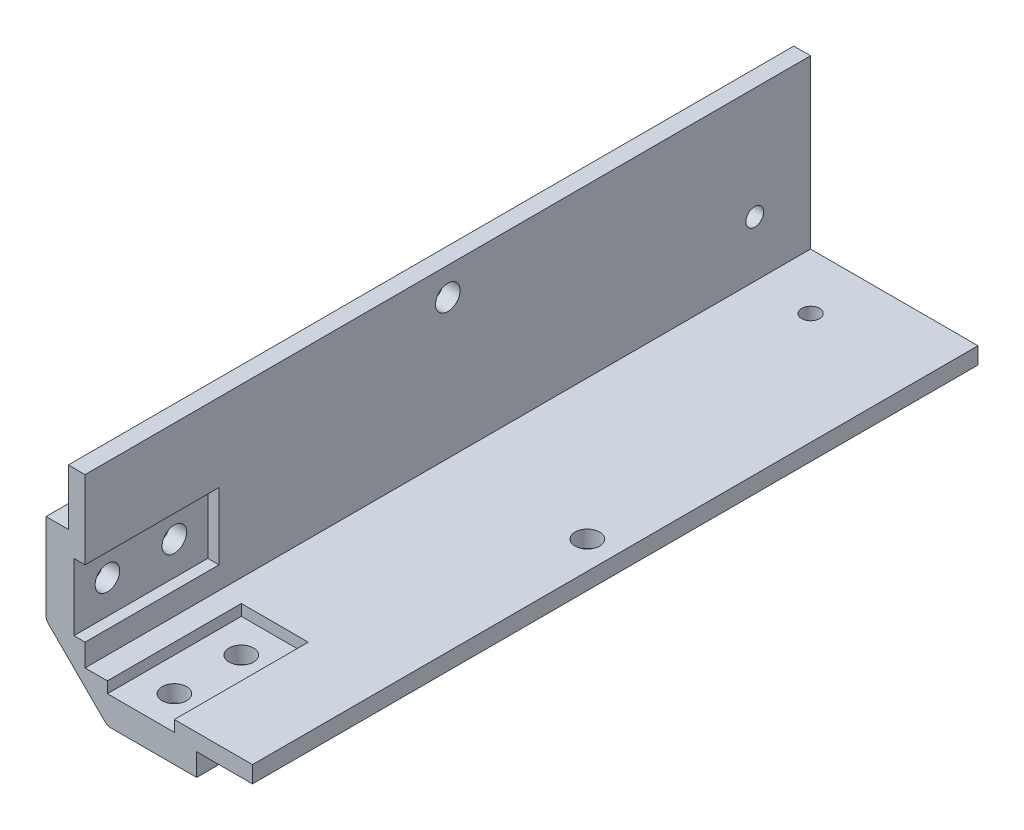
ISO-10303-21;
HEADER;
FILE_DESCRIPTION(('STEP AP214'),'2;1');
FILE_NAME('part.step','',(''),(''),'','','');
FILE_SCHEMA(('AUTOMOTIVE_DESIGN { 1 0 10303 214 1 1 1 1 }'));
ENDSEC;
DATA;
#1=APPLICATION_CONTEXT('core data for automotive mechanical design processes');
#2=APPLICATION_PROTOCOL_DEFINITION('international standard','automotive_design',2000,#1);
#3=PRODUCT_CONTEXT('',#1,'mechanical');
#4=PRODUCT('Part','Part','',(#3));
#5=PRODUCT_RELATED_PRODUCT_CATEGORY('part','',(#4));
#6=PRODUCT_DEFINITION_FORMATION('','',#4);
#7=PRODUCT_DEFINITION_CONTEXT('part definition',#1,'design');
#8=PRODUCT_DEFINITION('design','',#6,#7);
#9=PRODUCT_DEFINITION_SHAPE('','',#8);
#10=(LENGTH_UNIT() NAMED_UNIT(*) SI_UNIT(.MILLI.,.METRE.));
#11=(NAMED_UNIT(*) PLANE_ANGLE_UNIT() SI_UNIT($,.RADIAN.));
#12=(NAMED_UNIT(*) SI_UNIT($,.STERADIAN.) SOLID_ANGLE_UNIT());
#13=UNCERTAINTY_MEASURE_WITH_UNIT(LENGTH_MEASURE(1.E-05),#10,'distance_accuracy_value','');
#14=(GEOMETRIC_REPRESENTATION_CONTEXT(3) GLOBAL_UNCERTAINTY_ASSIGNED_CONTEXT((#13)) GLOBAL_UNIT_ASSIGNED_CONTEXT((#10,
#11,#12)) REPRESENTATION_CONTEXT('',''));
#15=CARTESIAN_POINT('',(0.,0.,0.));
#16=DIRECTION('',(0.,0.,1.));
#17=DIRECTION('',(1.,0.,0.));
#18=AXIS2_PLACEMENT_3D('',#15,#16,#17);
#19=CARTESIAN_POINT('',(0.,0.,150.));
#20=DIRECTION('',(1.,0.,0.));
#21=DIRECTION('',(0.,1.,0.));
#22=AXIS2_PLACEMENT_3D('',#19,#20,#21);
#23=PLANE('',#22);
#24=CARTESIAN_POINT('',(0.,25.,215.));
#25=DIRECTION('',(-1.,0.,0.));
#26=DIRECTION('',(0.,0.,1.));
#27=AXIS2_PLACEMENT_3D('',#24,#25,#26);
#28=CIRCLE('',#27,2.19999999999999);
#29=CARTESIAN_POINT('',(0.,25.,217.2));
#30=VERTEX_POINT('',#29);
#31=EDGE_CURVE('E879',#30,#30,#28,.T.);
#32=ORIENTED_EDGE('',*,*,#31,.T.);
#33=EDGE_LOOP('',(#32));
#34=FACE_BOUND('',#33,.T.);
#35=CARTESIAN_POINT('',(0.,9.99999999999999,160.));
#36=DIRECTION('',(1.,0.,0.));
#37=DIRECTION('',(0.,1.,0.));
#38=AXIS2_PLACEMENT_3D('',#35,#36,#37);
#39=CIRCLE('',#38,1.59999999999999);
#40=CARTESIAN_POINT('',(0.,11.6,160.));
#41=VERTEX_POINT('',#40);
#42=EDGE_CURVE('E299',#41,#41,#39,.T.);
#43=ORIENTED_EDGE('',*,*,#42,.F.);
#44=EDGE_LOOP('',(#43));
#45=FACE_BOUND('',#44,.T.);
#46=DIRECTION('',(0.,1.,0.));
#47=VECTOR('',#46,1.);
#48=CARTESIAN_POINT('',(0.,0.,280.));
#49=LINE('',#48,#47);
#50=CARTESIAN_POINT('',(0.,16.,280.));
#51=VERTEX_POINT('',#50);
#52=CARTESIAN_POINT('',(0.,30.,280.));
#53=VERTEX_POINT('',#52);
#54=EDGE_CURVE('E405',#51,#53,#49,.T.);
#55=ORIENTED_EDGE('',*,*,#54,.F.);
#56=DIRECTION('',(0.,0.,-1.));
#57=VECTOR('',#56,1.);
#58=CARTESIAN_POINT('',(0.,16.,280.));
#59=LINE('',#58,#57);
#60=CARTESIAN_POINT('',(0.,16.,256.));
#61=VERTEX_POINT('',#60);
#62=EDGE_CURVE('E213',#51,#61,#59,.T.);
#63=ORIENTED_EDGE('',*,*,#62,.T.);
#64=DIRECTION('',(0.,-1.,0.));
#65=VECTOR('',#64,1.);
#66=CARTESIAN_POINT('',(0.,16.,256.));
#67=LINE('',#66,#65);
#68=CARTESIAN_POINT('',(0.,3.99999999999999,256.));
#69=VERTEX_POINT('',#68);
#70=EDGE_CURVE('E461',#61,#69,#67,.T.);
#71=ORIENTED_EDGE('',*,*,#70,.T.);
#72=DIRECTION('',(0.,0.,-1.));
#73=VECTOR('',#72,1.);
#74=CARTESIAN_POINT('',(0.,3.99999999999999,280.));
#75=LINE('',#74,#73);
#76=CARTESIAN_POINT('',(0.,3.99999999999999,280.));
#77=VERTEX_POINT('',#76);
#78=EDGE_CURVE('E455',#77,#69,#75,.T.);
#79=ORIENTED_EDGE('',*,*,#78,.F.);
#80=CARTESIAN_POINT('',(0.,0.,280.));
#81=VERTEX_POINT('',#80);
#82=EDGE_CURVE('E218',#81,#77,#49,.T.);
#83=ORIENTED_EDGE('',*,*,#82,.F.);
#84=DIRECTION('',(0.,0.,1.));
#85=VECTOR('',#84,1.);
#86=CARTESIAN_POINT('',(0.,0.,150.));
#87=LINE('',#86,#85);
#88=CARTESIAN_POINT('',(0.,0.,150.));
#89=VERTEX_POINT('',#88);
#90=EDGE_CURVE('E387',#89,#81,#87,.T.);
#91=ORIENTED_EDGE('',*,*,#90,.F.);
#92=DIRECTION('',(0.,1.,0.));
#93=VECTOR('',#92,1.);
#94=CARTESIAN_POINT('',(0.,0.,150.));
#95=LINE('',#94,#93);
#96=CARTESIAN_POINT('',(0.,30.,150.));
#97=VERTEX_POINT('',#96);
#98=EDGE_CURVE('E380',#89,#97,#95,.T.);
#99=ORIENTED_EDGE('',*,*,#98,.T.);
#100=DIRECTION('',(0.,0.,-1.));
#101=VECTOR('',#100,1.);
#102=CARTESIAN_POINT('',(0.,30.,280.));
#103=LINE('',#102,#101);
#104=EDGE_CURVE('E322',#53,#97,#103,.T.);
#105=ORIENTED_EDGE('',*,*,#104,.F.);
#106=EDGE_LOOP('',(#55,#63,#71,#79,#83,#91,#99,#105));
#107=FACE_BOUND('',#106,.T.);
#108=ADVANCED_FACE('F49',(#34,#45,#107),#23,.T.);
#109=CARTESIAN_POINT('',(0.,0.,280.));
#110=DIRECTION('',(0.,0.,1.));
#111=DIRECTION('',(1.,0.,0.));
#112=AXIS2_PLACEMENT_3D('',#109,#110,#111);
#113=PLANE('',#112);
#114=DIRECTION('',(0.,-1.,0.));
#115=VECTOR('',#114,1.);
#116=CARTESIAN_POINT('',(-2.,16.,280.));
#117=LINE('',#116,#115);
#118=CARTESIAN_POINT('',(-2.,16.,280.));
#119=VERTEX_POINT('',#118);
#120=CARTESIAN_POINT('',(-2.,3.99999999999999,280.));
#121=VERTEX_POINT('',#120);
#122=EDGE_CURVE('E206',#119,#121,#117,.T.);
#123=ORIENTED_EDGE('',*,*,#122,.F.);
#124=DIRECTION('',(1.,0.,0.));
#125=VECTOR('',#124,1.);
#126=CARTESIAN_POINT('',(-2.,16.,280.));
#127=LINE('',#126,#125);
#128=EDGE_CURVE('E235',#119,#51,#127,.T.);
#129=ORIENTED_EDGE('',*,*,#128,.T.);
#130=ORIENTED_EDGE('',*,*,#54,.T.);
#131=DIRECTION('',(1.,0.,0.));
#132=VECTOR('',#131,1.);
#133=CARTESIAN_POINT('',(-3.,30.,280.));
#134=LINE('',#133,#132);
#135=CARTESIAN_POINT('',(-3.,30.,280.));
#136=VERTEX_POINT('',#135);
#137=EDGE_CURVE('E318',#136,#53,#134,.T.);
#138=ORIENTED_EDGE('',*,*,#137,.F.);
#139=DIRECTION('',(0.,-1.,0.));
#140=VECTOR('',#139,1.);
#141=CARTESIAN_POINT('',(-3.,20.,280.));
#142=LINE('',#141,#140);
#143=CARTESIAN_POINT('',(-3.,20.,280.));
#144=VERTEX_POINT('',#143);
#145=EDGE_CURVE('E366',#136,#144,#142,.T.);
#146=ORIENTED_EDGE('',*,*,#145,.T.);
#147=DIRECTION('',(1.,0.,0.));
#148=VECTOR('',#147,1.);
#149=CARTESIAN_POINT('',(-137.648383074572,20.,280.));
#150=LINE('',#149,#148);
#151=CARTESIAN_POINT('',(-7.00000000000001,20.,280.));
#152=VERTEX_POINT('',#151);
#153=EDGE_CURVE('E305',#152,#144,#150,.T.);
#154=ORIENTED_EDGE('',*,*,#153,.F.);
#155=DIRECTION('',(0.,-1.,0.));
#156=VECTOR('',#155,1.);
#157=CARTESIAN_POINT('',(-7.,7.,280.));
#158=LINE('',#157,#156);
#159=CARTESIAN_POINT('',(-7.,4.62132034355964,280.));
#160=VERTEX_POINT('',#159);
#161=EDGE_CURVE('E360',#152,#160,#158,.T.);
#162=ORIENTED_EDGE('',*,*,#161,.T.);
#163=CARTESIAN_POINT('',(-5.5,4.62132034355964,280.));
#164=DIRECTION('',(0.,0.,1.));
#165=DIRECTION('',(1.,0.,0.));
#166=AXIS2_PLACEMENT_3D('',#163,#164,#165);
#167=CIRCLE('',#166,1.5);
#168=CARTESIAN_POINT('',(-6.56066017177982,3.56066017177982,280.));
#169=VERTEX_POINT('',#168);
#170=EDGE_CURVE('E420',#160,#169,#167,.T.);
#171=ORIENTED_EDGE('',*,*,#170,.T.);
#172=DIRECTION('',(0.707106781186548,-0.707106781186548,0.));
#173=VECTOR('',#172,1.);
#174=CARTESIAN_POINT('',(-7.,4.,280.));
#175=LINE('',#174,#173);
#176=CARTESIAN_POINT('',(3.56066017177982,-6.56066017177982,280.));
#177=VERTEX_POINT('',#176);
#178=EDGE_CURVE('E391',#169,#177,#175,.T.);
#179=ORIENTED_EDGE('',*,*,#178,.T.);
#180=CARTESIAN_POINT('',(4.62132034355964,-5.5,280.));
#181=DIRECTION('',(0.,0.,1.));
#182=DIRECTION('',(1.,0.,0.));
#183=AXIS2_PLACEMENT_3D('',#180,#181,#182);
#184=CIRCLE('',#183,1.5);
#185=CARTESIAN_POINT('',(4.62132034355964,-7.,280.));
#186=VERTEX_POINT('',#185);
#187=EDGE_CURVE('E417',#177,#186,#184,.T.);
#188=ORIENTED_EDGE('',*,*,#187,.T.);
#189=DIRECTION('',(1.,0.,0.));
#190=VECTOR('',#189,1.);
#191=CARTESIAN_POINT('',(4.,-7.,280.));
#192=LINE('',#191,#190);
#193=CARTESIAN_POINT('',(20.,-7.00000000000001,280.));
#194=VERTEX_POINT('',#193);
#195=EDGE_CURVE('E395',#186,#194,#192,.T.);
#196=ORIENTED_EDGE('',*,*,#195,.T.);
#197=DIRECTION('',(0.,1.,0.));
#198=VECTOR('',#197,1.);
#199=CARTESIAN_POINT('',(20.,-137.648383074572,280.));
#200=LINE('',#199,#198);
#201=CARTESIAN_POINT('',(20.,-3.,280.));
#202=VERTEX_POINT('',#201);
#203=EDGE_CURVE('E334',#194,#202,#200,.T.);
#204=ORIENTED_EDGE('',*,*,#203,.T.);
#205=DIRECTION('',(1.,0.,0.));
#206=VECTOR('',#205,1.);
#207=CARTESIAN_POINT('',(7.,-3.,280.));
#208=LINE('',#207,#206);
#209=CARTESIAN_POINT('',(30.,-3.,280.));
#210=VERTEX_POINT('',#209);
#211=EDGE_CURVE('E398',#202,#210,#208,.T.);
#212=ORIENTED_EDGE('',*,*,#211,.T.);
#213=DIRECTION('',(0.,-1.,0.));
#214=VECTOR('',#213,1.);
#215=CARTESIAN_POINT('',(30.,0.,280.));
#216=LINE('',#215,#214);
#217=CARTESIAN_POINT('',(30.,0.,280.));
#218=VERTEX_POINT('',#217);
#219=EDGE_CURVE('E348',#218,#210,#216,.T.);
#220=ORIENTED_EDGE('',*,*,#219,.F.);
#221=DIRECTION('',(-1.,0.,0.));
#222=VECTOR('',#221,1.);
#223=CARTESIAN_POINT('',(20.,0.,280.));
#224=LINE('',#223,#222);
#225=CARTESIAN_POINT('',(16.,0.,280.));
#226=VERTEX_POINT('',#225);
#227=EDGE_CURVE('E401',#218,#226,#224,.T.);
#228=ORIENTED_EDGE('',*,*,#227,.T.);
#229=DIRECTION('',(0.,1.,0.));
#230=VECTOR('',#229,1.);
#231=CARTESIAN_POINT('',(16.,-2.,280.));
#232=LINE('',#231,#230);
#233=CARTESIAN_POINT('',(16.,-2.,280.));
#234=VERTEX_POINT('',#233);
#235=EDGE_CURVE('E278',#234,#226,#232,.T.);
#236=ORIENTED_EDGE('',*,*,#235,.F.);
#237=DIRECTION('',(1.,0.,0.));
#238=VECTOR('',#237,1.);
#239=CARTESIAN_POINT('',(4.,-2.,280.));
#240=LINE('',#239,#238);
#241=CARTESIAN_POINT('',(4.,-2.,280.));
#242=VERTEX_POINT('',#241);
#243=EDGE_CURVE('E250',#242,#234,#240,.T.);
#244=ORIENTED_EDGE('',*,*,#243,.F.);
#245=DIRECTION('',(0.,1.,0.));
#246=VECTOR('',#245,1.);
#247=CARTESIAN_POINT('',(4.,-2.,280.));
#248=LINE('',#247,#246);
#249=CARTESIAN_POINT('',(4.,0.,280.));
#250=VERTEX_POINT('',#249);
#251=EDGE_CURVE('E261',#242,#250,#248,.T.);
#252=ORIENTED_EDGE('',*,*,#251,.T.);
#253=EDGE_CURVE('E400',#250,#81,#224,.T.);
#254=ORIENTED_EDGE('',*,*,#253,.T.);
#255=ORIENTED_EDGE('',*,*,#82,.T.);
#256=DIRECTION('',(1.,0.,0.));
#257=VECTOR('',#256,1.);
#258=CARTESIAN_POINT('',(-2.,3.99999999999999,280.));
#259=LINE('',#258,#257);
#260=EDGE_CURVE('E201',#121,#77,#259,.T.);
#261=ORIENTED_EDGE('',*,*,#260,.F.);
#262=EDGE_LOOP('',(#123,#129,#130,#138,#146,#154,#162,#171,#179,#188,#196,#204,#212,#220,#228,
#236,#244,#252,#254,#255,#261));
#263=FACE_BOUND('',#262,.T.);
#264=ADVANCED_FACE('F216',(#263),#113,.T.);
#265=CARTESIAN_POINT('',(-3.,20.,150.));
#266=DIRECTION('',(-1.,0.,0.));
#267=DIRECTION('',(0.,0.,1.));
#268=AXIS2_PLACEMENT_3D('',#265,#266,#267);
#269=PLANE('',#268);
#270=CARTESIAN_POINT('',(-3.,25.,215.));
#271=DIRECTION('',(-1.,0.,0.));
#272=DIRECTION('',(0.,0.,1.));
#273=AXIS2_PLACEMENT_3D('',#270,#271,#272);
#274=CIRCLE('',#273,2.19999999999999);
#275=CARTESIAN_POINT('',(-3.,25.,217.2));
#276=VERTEX_POINT('',#275);
#277=EDGE_CURVE('E873',#276,#276,#274,.T.);
#278=ORIENTED_EDGE('',*,*,#277,.F.);
#279=EDGE_LOOP('',(#278));
#280=FACE_BOUND('',#279,.T.);
#281=DIRECTION('',(0.,-1.,0.));
#282=VECTOR('',#281,1.);
#283=CARTESIAN_POINT('',(-3.,20.,150.));
#284=LINE('',#283,#282);
#285=CARTESIAN_POINT('',(-3.,30.,150.));
#286=VERTEX_POINT('',#285);
#287=CARTESIAN_POINT('',(-3.,20.,150.));
#288=VERTEX_POINT('',#287);
#289=EDGE_CURVE('E383',#286,#288,#284,.T.);
#290=ORIENTED_EDGE('',*,*,#289,.T.);
#291=DIRECTION('',(0.,0.,-1.));
#292=VECTOR('',#291,1.);
#293=CARTESIAN_POINT('',(-3.,20.,280.));
#294=LINE('',#293,#292);
#295=EDGE_CURVE('E300',#144,#288,#294,.T.);
#296=ORIENTED_EDGE('',*,*,#295,.F.);
#297=ORIENTED_EDGE('',*,*,#145,.F.);
#298=DIRECTION('',(0.,0.,1.));
#299=VECTOR('',#298,1.);
#300=CARTESIAN_POINT('',(-3.,30.,150.));
#301=LINE('',#300,#299);
#302=EDGE_CURVE('E310',#286,#136,#301,.T.);
#303=ORIENTED_EDGE('',*,*,#302,.F.);
#304=EDGE_LOOP('',(#290,#296,#297,#303));
#305=FACE_BOUND('',#304,.T.);
#306=ADVANCED_FACE('F530',(#280,#305),#269,.T.);
#307=CARTESIAN_POINT('',(7.,-3.,150.));
#308=DIRECTION('',(0.,-1.,0.));
#309=DIRECTION('',(0.,0.,-1.));
#310=AXIS2_PLACEMENT_3D('',#307,#308,#309);
#311=PLANE('',#310);
#312=CARTESIAN_POINT('',(25.,-3.,215.));
#313=DIRECTION('',(0.,-1.,0.));
#314=DIRECTION('',(0.,0.,-1.));
#315=AXIS2_PLACEMENT_3D('',#312,#313,#314);
#316=CIRCLE('',#315,2.19999999999999);
#317=CARTESIAN_POINT('',(25.,-3.,212.8));
#318=VERTEX_POINT('',#317);
#319=EDGE_CURVE('E869',#318,#318,#316,.T.);
#320=ORIENTED_EDGE('',*,*,#319,.F.);
#321=EDGE_LOOP('',(#320));
#322=FACE_BOUND('',#321,.T.);
#323=ORIENTED_EDGE('',*,*,#211,.F.);
#324=DIRECTION('',(0.,0.,1.));
#325=VECTOR('',#324,1.);
#326=CARTESIAN_POINT('',(20.,-3.,150.));
#327=LINE('',#326,#325);
#328=CARTESIAN_POINT('',(20.,-3.,150.));
#329=VERTEX_POINT('',#328);
#330=EDGE_CURVE('E331',#329,#202,#327,.T.);
#331=ORIENTED_EDGE('',*,*,#330,.F.);
#332=DIRECTION('',(1.,0.,0.));
#333=VECTOR('',#332,1.);
#334=CARTESIAN_POINT('',(7.,-3.,150.));
#335=LINE('',#334,#333);
#336=CARTESIAN_POINT('',(30.,-3.,150.));
#337=VERTEX_POINT('',#336);
#338=EDGE_CURVE('E373',#329,#337,#335,.T.);
#339=ORIENTED_EDGE('',*,*,#338,.T.);
#340=DIRECTION('',(0.,0.,-1.));
#341=VECTOR('',#340,1.);
#342=CARTESIAN_POINT('',(30.,-3.,280.));
#343=LINE('',#342,#341);
#344=EDGE_CURVE('E352',#210,#337,#343,.T.);
#345=ORIENTED_EDGE('',*,*,#344,.F.);
#346=EDGE_LOOP('',(#323,#331,#339,#345));
#347=FACE_BOUND('',#346,.T.);
#348=ADVANCED_FACE('F500',(#322,#347),#311,.T.);
#349=CARTESIAN_POINT('',(-7.,7.,150.));
#350=DIRECTION('',(-1.,0.,0.));
#351=DIRECTION('',(0.,0.,1.));
#352=AXIS2_PLACEMENT_3D('',#349,#350,#351);
#353=PLANE('',#352);
#354=CARTESIAN_POINT('',(-7.,9.99999999999999,160.));
#355=DIRECTION('',(-1.,0.,0.));
#356=DIRECTION('',(0.,0.,1.));
#357=AXIS2_PLACEMENT_3D('',#354,#355,#356);
#358=CIRCLE('',#357,3.36);
#359=CARTESIAN_POINT('',(-7.,9.99999999999999,163.36));
#360=VERTEX_POINT('',#359);
#361=EDGE_CURVE('E291',#360,#360,#358,.T.);
#362=ORIENTED_EDGE('',*,*,#361,.F.);
#363=EDGE_LOOP('',(#362));
#364=FACE_BOUND('',#363,.T.);
#365=DIRECTION('',(0.,-1.,0.));
#366=VECTOR('',#365,1.);
#367=CARTESIAN_POINT('',(-7.,7.,150.));
#368=LINE('',#367,#366);
#369=CARTESIAN_POINT('',(-7.00000000000001,20.,150.));
#370=VERTEX_POINT('',#369);
#371=CARTESIAN_POINT('',(-7.,4.62132034355964,150.));
#372=VERTEX_POINT('',#371);
#373=EDGE_CURVE('E361',#370,#372,#368,.T.);
#374=ORIENTED_EDGE('',*,*,#373,.T.);
#375=DIRECTION('',(0.,0.,1.));
#376=VECTOR('',#375,1.);
#377=CARTESIAN_POINT('',(-7.,4.62132034355964,150.));
#378=LINE('',#377,#376);
#379=EDGE_CURVE('E414',#372,#160,#378,.T.);
#380=ORIENTED_EDGE('',*,*,#379,.T.);
#381=ORIENTED_EDGE('',*,*,#161,.F.);
#382=DIRECTION('',(0.,0.,-1.));
#383=VECTOR('',#382,1.);
#384=CARTESIAN_POINT('',(-7.00000000000001,20.,280.));
#385=LINE('',#384,#383);
#386=EDGE_CURVE('E306',#152,#370,#385,.T.);
#387=ORIENTED_EDGE('',*,*,#386,.T.);
#388=EDGE_LOOP('',(#374,#380,#381,#387));
#389=FACE_BOUND('',#388,.T.);
#390=ADVANCED_FACE('F522',(#364,#389),#353,.T.);
#391=CARTESIAN_POINT('',(20.,0.,150.));
#392=DIRECTION('',(0.,1.,0.));
#393=DIRECTION('',(0.,0.,1.));
#394=AXIS2_PLACEMENT_3D('',#391,#392,#393);
#395=PLANE('',#394);
#396=CARTESIAN_POINT('',(25.,0.,215.));
#397=DIRECTION('',(0.,-1.,0.));
#398=DIRECTION('',(0.,0.,-1.));
#399=AXIS2_PLACEMENT_3D('',#396,#397,#398);
#400=CIRCLE('',#399,2.19999999999999);
#401=CARTESIAN_POINT('',(25.,0.,212.8));
#402=VERTEX_POINT('',#401);
#403=EDGE_CURVE('E866',#402,#402,#400,.T.);
#404=ORIENTED_EDGE('',*,*,#403,.T.);
#405=EDGE_LOOP('',(#404));
#406=FACE_BOUND('',#405,.T.);
#407=DIRECTION('',(0.,0.,1.));
#408=VECTOR('',#407,1.);
#409=CARTESIAN_POINT('',(4.,0.,280.));
#410=LINE('',#409,#408);
#411=CARTESIAN_POINT('',(4.,0.,256.));
#412=VERTEX_POINT('',#411);
#413=EDGE_CURVE('E247',#412,#250,#410,.T.);
#414=ORIENTED_EDGE('',*,*,#413,.F.);
#415=DIRECTION('',(-1.,0.,0.));
#416=VECTOR('',#415,1.);
#417=CARTESIAN_POINT('',(4.,0.,256.));
#418=LINE('',#417,#416);
#419=CARTESIAN_POINT('',(16.,0.,256.));
#420=VERTEX_POINT('',#419);
#421=EDGE_CURVE('E251',#420,#412,#418,.T.);
#422=ORIENTED_EDGE('',*,*,#421,.F.);
#423=DIRECTION('',(0.,0.,-1.));
#424=VECTOR('',#423,1.);
#425=CARTESIAN_POINT('',(16.,0.,280.));
#426=LINE('',#425,#424);
#427=EDGE_CURVE('E264',#226,#420,#426,.T.);
#428=ORIENTED_EDGE('',*,*,#427,.F.);
#429=ORIENTED_EDGE('',*,*,#227,.F.);
#430=DIRECTION('',(0.,0.,1.));
#431=VECTOR('',#430,1.);
#432=CARTESIAN_POINT('',(30.,0.,150.));
#433=LINE('',#432,#431);
#434=CARTESIAN_POINT('',(30.,0.,150.));
#435=VERTEX_POINT('',#434);
#436=EDGE_CURVE('E339',#435,#218,#433,.T.);
#437=ORIENTED_EDGE('',*,*,#436,.F.);
#438=DIRECTION('',(-1.,0.,0.));
#439=VECTOR('',#438,1.);
#440=CARTESIAN_POINT('',(20.,0.,150.));
#441=LINE('',#440,#439);
#442=EDGE_CURVE('E376',#435,#89,#441,.T.);
#443=ORIENTED_EDGE('',*,*,#442,.T.);
#444=ORIENTED_EDGE('',*,*,#90,.T.);
#445=ORIENTED_EDGE('',*,*,#253,.F.);
#446=EDGE_LOOP('',(#414,#422,#428,#429,#437,#443,#444,#445));
#447=FACE_BOUND('',#446,.T.);
#448=CARTESIAN_POINT('',(10.,0.,160.));
#449=DIRECTION('',(0.,1.,0.));
#450=DIRECTION('',(0.,0.,1.));
#451=AXIS2_PLACEMENT_3D('',#448,#449,#450);
#452=CIRCLE('',#451,1.59999999999999);
#453=CARTESIAN_POINT('',(10.,0.,161.6));
#454=VERTEX_POINT('',#453);
#455=EDGE_CURVE('E53',#454,#454,#452,.T.);
#456=ORIENTED_EDGE('',*,*,#455,.F.);
#457=EDGE_LOOP('',(#456));
#458=FACE_BOUND('',#457,.T.);
#459=ADVANCED_FACE('F486',(#406,#447,#458),#395,.T.);
#460=CARTESIAN_POINT('',(4.,-7.,150.));
#461=DIRECTION('',(0.,-1.,0.));
#462=DIRECTION('',(0.,0.,-1.));
#463=AXIS2_PLACEMENT_3D('',#460,#461,#462);
#464=PLANE('',#463);
#465=CARTESIAN_POINT('',(10.,-7.,160.));
#466=DIRECTION('',(0.,-1.,0.));
#467=DIRECTION('',(0.,0.,-1.));
#468=AXIS2_PLACEMENT_3D('',#465,#466,#467);
#469=CIRCLE('',#468,3.36);
#470=CARTESIAN_POINT('',(10.,-7.,156.64));
#471=VERTEX_POINT('',#470);
#472=EDGE_CURVE('E274',#471,#471,#469,.T.);
#473=ORIENTED_EDGE('',*,*,#472,.F.);
#474=EDGE_LOOP('',(#473));
#475=FACE_BOUND('',#474,.T.);
#476=ORIENTED_EDGE('',*,*,#195,.F.);
#477=DIRECTION('',(0.,0.,1.));
#478=VECTOR('',#477,1.);
#479=CARTESIAN_POINT('',(4.62132034355964,-7.,150.));
#480=LINE('',#479,#478);
#481=CARTESIAN_POINT('',(4.62132034355964,-7.,150.));
#482=VERTEX_POINT('',#481);
#483=EDGE_CURVE('E11',#186,#482,#480,.F.);
#484=ORIENTED_EDGE('',*,*,#483,.T.);
#485=DIRECTION('',(1.,0.,0.));
#486=VECTOR('',#485,1.);
#487=CARTESIAN_POINT('',(4.,-7.,150.));
#488=LINE('',#487,#486);
#489=CARTESIAN_POINT('',(20.,-7.00000000000001,150.));
#490=VERTEX_POINT('',#489);
#491=EDGE_CURVE('E370',#482,#490,#488,.T.);
#492=ORIENTED_EDGE('',*,*,#491,.T.);
#493=DIRECTION('',(0.,0.,1.));
#494=VECTOR('',#493,1.);
#495=CARTESIAN_POINT('',(20.,-7.00000000000001,150.));
#496=LINE('',#495,#494);
#497=EDGE_CURVE('E335',#490,#194,#496,.T.);
#498=ORIENTED_EDGE('',*,*,#497,.T.);
#499=EDGE_LOOP('',(#476,#484,#492,#498));
#500=FACE_BOUND('',#499,.T.);
#501=ADVANCED_FACE('F507',(#475,#500),#464,.T.);
#502=CARTESIAN_POINT('',(-7.,4.,150.));
#503=DIRECTION('',(-0.707106781186548,-0.707106781186548,0.));
#504=DIRECTION('',(0.707106781186548,-0.707106781186548,0.));
#505=AXIS2_PLACEMENT_3D('',#502,#503,#504);
#506=PLANE('',#505);
#507=ORIENTED_EDGE('',*,*,#178,.F.);
#508=DIRECTION('',(0.,0.,1.));
#509=VECTOR('',#508,1.);
#510=CARTESIAN_POINT('',(-6.56066017177982,3.56066017177982,150.));
#511=LINE('',#510,#509);
#512=CARTESIAN_POINT('',(-6.56066017177982,3.56066017177982,150.));
#513=VERTEX_POINT('',#512);
#514=EDGE_CURVE('E427',#169,#513,#511,.F.);
#515=ORIENTED_EDGE('',*,*,#514,.T.);
#516=DIRECTION('',(0.707106781186548,-0.707106781186548,0.));
#517=VECTOR('',#516,1.);
#518=CARTESIAN_POINT('',(-7.,4.,150.));
#519=LINE('',#518,#517);
#520=CARTESIAN_POINT('',(3.56066017177982,-6.56066017177982,150.));
#521=VERTEX_POINT('',#520);
#522=EDGE_CURVE('E365',#513,#521,#519,.T.);
#523=ORIENTED_EDGE('',*,*,#522,.T.);
#524=DIRECTION('',(0.,0.,1.));
#525=VECTOR('',#524,1.);
#526=CARTESIAN_POINT('',(3.56066017177982,-6.56066017177982,150.));
#527=LINE('',#526,#525);
#528=EDGE_CURVE('E423',#521,#177,#527,.T.);
#529=ORIENTED_EDGE('',*,*,#528,.T.);
#530=EDGE_LOOP('',(#507,#515,#523,#529));
#531=FACE_BOUND('',#530,.T.);
#532=ADVANCED_FACE('F515',(#531),#506,.T.);
#533=CARTESIAN_POINT('',(0.,0.,150.));
#534=DIRECTION('',(0.,0.,1.));
#535=DIRECTION('',(1.,0.,0.));
#536=AXIS2_PLACEMENT_3D('',#533,#534,#535);
#537=PLANE('',#536);
#538=ORIENTED_EDGE('',*,*,#373,.F.);
#539=DIRECTION('',(1.,0.,0.));
#540=VECTOR('',#539,1.);
#541=CARTESIAN_POINT('',(-137.648383074572,20.,150.));
#542=LINE('',#541,#540);
#543=EDGE_CURVE('E304',#370,#288,#542,.T.);
#544=ORIENTED_EDGE('',*,*,#543,.T.);
#545=ORIENTED_EDGE('',*,*,#289,.F.);
#546=DIRECTION('',(-1.,0.,0.));
#547=VECTOR('',#546,1.);
#548=CARTESIAN_POINT('',(0.,30.,150.));
#549=LINE('',#548,#547);
#550=EDGE_CURVE('E326',#97,#286,#549,.T.);
#551=ORIENTED_EDGE('',*,*,#550,.F.);
#552=ORIENTED_EDGE('',*,*,#98,.F.);
#553=ORIENTED_EDGE('',*,*,#442,.F.);
#554=DIRECTION('',(0.,1.,0.));
#555=VECTOR('',#554,1.);
#556=CARTESIAN_POINT('',(30.,-3.,150.));
#557=LINE('',#556,#555);
#558=EDGE_CURVE('E356',#337,#435,#557,.T.);
#559=ORIENTED_EDGE('',*,*,#558,.F.);
#560=ORIENTED_EDGE('',*,*,#338,.F.);
#561=DIRECTION('',(0.,1.,0.));
#562=VECTOR('',#561,1.);
#563=CARTESIAN_POINT('',(20.,-137.648383074572,150.));
#564=LINE('',#563,#562);
#565=EDGE_CURVE('E330',#490,#329,#564,.T.);
#566=ORIENTED_EDGE('',*,*,#565,.F.);
#567=ORIENTED_EDGE('',*,*,#491,.F.);
#568=CARTESIAN_POINT('',(4.62132034355964,-5.5,150.));
#569=DIRECTION('',(0.,0.,1.));
#570=DIRECTION('',(1.,0.,0.));
#571=AXIS2_PLACEMENT_3D('',#568,#569,#570);
#572=CIRCLE('',#571,1.5);
#573=EDGE_CURVE('E430',#482,#521,#572,.F.);
#574=ORIENTED_EDGE('',*,*,#573,.T.);
#575=ORIENTED_EDGE('',*,*,#522,.F.);
#576=CARTESIAN_POINT('',(-5.5,4.62132034355964,150.));
#577=DIRECTION('',(0.,0.,1.));
#578=DIRECTION('',(1.,0.,0.));
#579=AXIS2_PLACEMENT_3D('',#576,#577,#578);
#580=CIRCLE('',#579,1.5);
#581=EDGE_CURVE('E59',#513,#372,#580,.F.);
#582=ORIENTED_EDGE('',*,*,#581,.T.);
#583=EDGE_LOOP('',(#538,#544,#545,#551,#552,#553,#559,#560,#566,#567,#574,#575,#582));
#584=FACE_BOUND('',#583,.T.);
#585=ADVANCED_FACE('F482',(#584),#537,.F.);
#586=CARTESIAN_POINT('',(-5.5,4.62132034355964,150.));
#587=DIRECTION('',(0.,0.,1.));
#588=DIRECTION('',(1.,0.,0.));
#589=AXIS2_PLACEMENT_3D('',#586,#587,#588);
#590=CYLINDRICAL_SURFACE('',#589,1.5);
#591=ORIENTED_EDGE('',*,*,#581,.F.);
#592=ORIENTED_EDGE('',*,*,#514,.F.);
#593=ORIENTED_EDGE('',*,*,#170,.F.);
#594=ORIENTED_EDGE('',*,*,#379,.F.);
#595=EDGE_LOOP('',(#591,#592,#593,#594));
#596=FACE_BOUND('',#595,.T.);
#597=ADVANCED_FACE('F518',(#596),#590,.T.);
#598=CARTESIAN_POINT('',(4.62132034355964,-5.5,150.));
#599=DIRECTION('',(0.,0.,1.));
#600=DIRECTION('',(1.,0.,0.));
#601=AXIS2_PLACEMENT_3D('',#598,#599,#600);
#602=CYLINDRICAL_SURFACE('',#601,1.5);
#603=ORIENTED_EDGE('',*,*,#573,.F.);
#604=ORIENTED_EDGE('',*,*,#483,.F.);
#605=ORIENTED_EDGE('',*,*,#187,.F.);
#606=ORIENTED_EDGE('',*,*,#528,.F.);
#607=EDGE_LOOP('',(#603,#604,#605,#606));
#608=FACE_BOUND('',#607,.T.);
#609=ADVANCED_FACE('F51',(#608),#602,.T.);
#610=CARTESIAN_POINT('',(30.,0.,0.));
#611=DIRECTION('',(1.,0.,0.));
#612=DIRECTION('',(0.,0.,-1.));
#613=AXIS2_PLACEMENT_3D('',#610,#611,#612);
#614=PLANE('',#613);
#615=ORIENTED_EDGE('',*,*,#436,.T.);
#616=ORIENTED_EDGE('',*,*,#219,.T.);
#617=ORIENTED_EDGE('',*,*,#344,.T.);
#618=ORIENTED_EDGE('',*,*,#558,.T.);
#619=EDGE_LOOP('',(#615,#616,#617,#618));
#620=FACE_BOUND('',#619,.T.);
#621=ADVANCED_FACE('F491',(#620),#614,.T.);
#622=CARTESIAN_POINT('',(20.,-137.648383074572,150.));
#623=DIRECTION('',(-1.,0.,0.));
#624=DIRECTION('',(0.,0.,1.));
#625=AXIS2_PLACEMENT_3D('',#622,#623,#624);
#626=PLANE('',#625);
#627=ORIENTED_EDGE('',*,*,#497,.F.);
#628=ORIENTED_EDGE('',*,*,#565,.T.);
#629=ORIENTED_EDGE('',*,*,#330,.T.);
#630=ORIENTED_EDGE('',*,*,#203,.F.);
#631=EDGE_LOOP('',(#627,#628,#629,#630));
#632=FACE_BOUND('',#631,.T.);
#633=ADVANCED_FACE('F503',(#632),#626,.F.);
#634=CARTESIAN_POINT('',(0.,30.,0.));
#635=DIRECTION('',(0.,1.,0.));
#636=DIRECTION('',(0.,0.,1.));
#637=AXIS2_PLACEMENT_3D('',#634,#635,#636);
#638=PLANE('',#637);
#639=ORIENTED_EDGE('',*,*,#302,.T.);
#640=ORIENTED_EDGE('',*,*,#137,.T.);
#641=ORIENTED_EDGE('',*,*,#104,.T.);
#642=ORIENTED_EDGE('',*,*,#550,.T.);
#643=EDGE_LOOP('',(#639,#640,#641,#642));
#644=FACE_BOUND('',#643,.T.);
#645=ADVANCED_FACE('F532',(#644),#638,.T.);
#646=CARTESIAN_POINT('',(-137.648383074572,20.,280.));
#647=DIRECTION('',(0.,-1.,0.));
#648=DIRECTION('',(0.,0.,-1.));
#649=AXIS2_PLACEMENT_3D('',#646,#647,#648);
#650=PLANE('',#649);
#651=ORIENTED_EDGE('',*,*,#386,.F.);
#652=ORIENTED_EDGE('',*,*,#153,.T.);
#653=ORIENTED_EDGE('',*,*,#295,.T.);
#654=ORIENTED_EDGE('',*,*,#543,.F.);
#655=EDGE_LOOP('',(#651,#652,#653,#654));
#656=FACE_BOUND('',#655,.T.);
#657=ADVANCED_FACE('F526',(#656),#650,.F.);
#658=CARTESIAN_POINT('',(-7.,9.99999999999999,160.));
#659=DIRECTION('',(-1.,0.,0.));
#660=DIRECTION('',(0.,0.,1.));
#661=AXIS2_PLACEMENT_3D('',#658,#659,#660);
#662=CYLINDRICAL_SURFACE('',#661,1.59999999999999);
#663=ORIENTED_EDGE('',*,*,#42,.T.);
#664=EDGE_LOOP('',(#663));
#665=FACE_BOUND('',#664,.T.);
#666=CARTESIAN_POINT('',(-5.24,9.99999999999999,160.));
#667=DIRECTION('',(-1.,0.,0.));
#668=DIRECTION('',(0.,0.,1.));
#669=AXIS2_PLACEMENT_3D('',#666,#667,#668);
#670=CIRCLE('',#669,1.6);
#671=CARTESIAN_POINT('',(-5.24,9.99999999999999,161.6));
#672=VERTEX_POINT('',#671);
#673=EDGE_CURVE('E295',#672,#672,#670,.T.);
#674=ORIENTED_EDGE('',*,*,#673,.T.);
#675=EDGE_LOOP('',(#674));
#676=FACE_BOUND('',#675,.T.);
#677=ADVANCED_FACE('F438',(#665,#676),#662,.F.);
#678=CARTESIAN_POINT('',(-7.,9.99999999999999,160.));
#679=DIRECTION('',(-1.,0.,0.));
#680=DIRECTION('',(0.,0.,1.));
#681=AXIS2_PLACEMENT_3D('',#678,#679,#680);
#682=CONICAL_SURFACE('',#681,3.36,0.785398163397448);
#683=ORIENTED_EDGE('',*,*,#673,.F.);
#684=EDGE_LOOP('',(#683));
#685=FACE_BOUND('',#684,.T.);
#686=ORIENTED_EDGE('',*,*,#361,.T.);
#687=EDGE_LOOP('',(#686));
#688=FACE_BOUND('',#687,.T.);
#689=ADVANCED_FACE('F610',(#685,#688),#682,.F.);
#690=CARTESIAN_POINT('',(10.,-7.,160.));
#691=DIRECTION('',(0.,-1.,0.));
#692=DIRECTION('',(0.,0.,-1.));
#693=AXIS2_PLACEMENT_3D('',#690,#691,#692);
#694=CYLINDRICAL_SURFACE('',#693,1.59999999999999);
#695=ORIENTED_EDGE('',*,*,#455,.T.);
#696=EDGE_LOOP('',(#695));
#697=FACE_BOUND('',#696,.T.);
#698=CARTESIAN_POINT('',(10.,-5.24,160.));
#699=DIRECTION('',(0.,-1.,0.));
#700=DIRECTION('',(0.,0.,-1.));
#701=AXIS2_PLACEMENT_3D('',#698,#699,#700);
#702=CIRCLE('',#701,1.6);
#703=CARTESIAN_POINT('',(10.,-5.24,158.4));
#704=VERTEX_POINT('',#703);
#705=EDGE_CURVE('E287',#704,#704,#702,.T.);
#706=ORIENTED_EDGE('',*,*,#705,.T.);
#707=EDGE_LOOP('',(#706));
#708=FACE_BOUND('',#707,.T.);
#709=ADVANCED_FACE('F618',(#697,#708),#694,.F.);
#710=CARTESIAN_POINT('',(10.,-7.,160.));
#711=DIRECTION('',(0.,-1.,0.));
#712=DIRECTION('',(0.,0.,-1.));
#713=AXIS2_PLACEMENT_3D('',#710,#711,#712);
#714=CONICAL_SURFACE('',#713,3.36,0.785398163397448);
#715=ORIENTED_EDGE('',*,*,#705,.F.);
#716=EDGE_LOOP('',(#715));
#717=FACE_BOUND('',#716,.T.);
#718=ORIENTED_EDGE('',*,*,#472,.T.);
#719=EDGE_LOOP('',(#718));
#720=FACE_BOUND('',#719,.T.);
#721=ADVANCED_FACE('F635',(#717,#720),#714,.F.);
#722=CARTESIAN_POINT('',(4.,-2.,280.));
#723=DIRECTION('',(-1.,0.,0.));
#724=DIRECTION('',(0.,0.,1.));
#725=AXIS2_PLACEMENT_3D('',#722,#723,#724);
#726=PLANE('',#725);
#727=ORIENTED_EDGE('',*,*,#413,.T.);
#728=ORIENTED_EDGE('',*,*,#251,.F.);
#729=DIRECTION('',(0.,0.,1.));
#730=VECTOR('',#729,1.);
#731=CARTESIAN_POINT('',(4.,-2.,280.));
#732=LINE('',#731,#730);
#733=CARTESIAN_POINT('',(4.,-2.,256.));
#734=VERTEX_POINT('',#733);
#735=EDGE_CURVE('E75',#734,#242,#732,.T.);
#736=ORIENTED_EDGE('',*,*,#735,.F.);
#737=DIRECTION('',(0.,1.,0.));
#738=VECTOR('',#737,1.);
#739=CARTESIAN_POINT('',(4.,-2.,256.));
#740=LINE('',#739,#738);
#741=EDGE_CURVE('E271',#734,#412,#740,.T.);
#742=ORIENTED_EDGE('',*,*,#741,.T.);
#743=EDGE_LOOP('',(#727,#728,#736,#742));
#744=FACE_BOUND('',#743,.T.);
#745=ADVANCED_FACE('F645',(#744),#726,.F.);
#746=CARTESIAN_POINT('',(4.,-2.,256.));
#747=DIRECTION('',(0.,0.,-1.));
#748=DIRECTION('',(-1.,0.,0.));
#749=AXIS2_PLACEMENT_3D('',#746,#747,#748);
#750=PLANE('',#749);
#751=ORIENTED_EDGE('',*,*,#421,.T.);
#752=ORIENTED_EDGE('',*,*,#741,.F.);
#753=DIRECTION('',(-1.,0.,0.));
#754=VECTOR('',#753,1.);
#755=CARTESIAN_POINT('',(4.,-2.,256.));
#756=LINE('',#755,#754);
#757=CARTESIAN_POINT('',(16.,-2.,256.));
#758=VERTEX_POINT('',#757);
#759=EDGE_CURVE('E258',#758,#734,#756,.T.);
#760=ORIENTED_EDGE('',*,*,#759,.F.);
#761=DIRECTION('',(0.,1.,0.));
#762=VECTOR('',#761,1.);
#763=CARTESIAN_POINT('',(16.,-2.,256.));
#764=LINE('',#763,#762);
#765=EDGE_CURVE('E275',#758,#420,#764,.T.);
#766=ORIENTED_EDGE('',*,*,#765,.T.);
#767=EDGE_LOOP('',(#751,#752,#760,#766));
#768=FACE_BOUND('',#767,.T.);
#769=ADVANCED_FACE('F655',(#768),#750,.F.);
#770=CARTESIAN_POINT('',(16.,-2.,280.));
#771=DIRECTION('',(1.,0.,0.));
#772=DIRECTION('',(0.,0.,-1.));
#773=AXIS2_PLACEMENT_3D('',#770,#771,#772);
#774=PLANE('',#773);
#775=ORIENTED_EDGE('',*,*,#427,.T.);
#776=ORIENTED_EDGE('',*,*,#765,.F.);
#777=DIRECTION('',(0.,0.,-1.));
#778=VECTOR('',#777,1.);
#779=CARTESIAN_POINT('',(16.,-2.,280.));
#780=LINE('',#779,#778);
#781=EDGE_CURVE('E254',#234,#758,#780,.T.);
#782=ORIENTED_EDGE('',*,*,#781,.F.);
#783=ORIENTED_EDGE('',*,*,#235,.T.);
#784=EDGE_LOOP('',(#775,#776,#782,#783));
#785=FACE_BOUND('',#784,.T.);
#786=ADVANCED_FACE('F665',(#785),#774,.F.);
#787=CARTESIAN_POINT('',(0.,-2.,0.));
#788=DIRECTION('',(0.,-1.,0.));
#789=DIRECTION('',(0.,0.,-1.));
#790=AXIS2_PLACEMENT_3D('',#787,#788,#789);
#791=PLANE('',#790);
#792=CARTESIAN_POINT('',(10.,-2.,274.));
#793=DIRECTION('',(0.,1.,0.));
#794=DIRECTION('',(0.,0.,1.));
#795=AXIS2_PLACEMENT_3D('',#792,#793,#794);
#796=CIRCLE('',#795,2.19999999999999);
#797=CARTESIAN_POINT('',(10.,-2.,276.2));
#798=VERTEX_POINT('',#797);
#799=EDGE_CURVE('E230',#798,#798,#796,.T.);
#800=ORIENTED_EDGE('',*,*,#799,.F.);
#801=EDGE_LOOP('',(#800));
#802=FACE_BOUND('',#801,.T.);
#803=CARTESIAN_POINT('',(10.,-2.,262.));
#804=DIRECTION('',(0.,1.,0.));
#805=DIRECTION('',(0.,0.,1.));
#806=AXIS2_PLACEMENT_3D('',#803,#804,#805);
#807=CIRCLE('',#806,2.19999999999999);
#808=CARTESIAN_POINT('',(10.,-2.,264.2));
#809=VERTEX_POINT('',#808);
#810=EDGE_CURVE('E239',#809,#809,#807,.T.);
#811=ORIENTED_EDGE('',*,*,#810,.F.);
#812=EDGE_LOOP('',(#811));
#813=FACE_BOUND('',#812,.T.);
#814=ORIENTED_EDGE('',*,*,#735,.T.);
#815=ORIENTED_EDGE('',*,*,#243,.T.);
#816=ORIENTED_EDGE('',*,*,#781,.T.);
#817=ORIENTED_EDGE('',*,*,#759,.T.);
#818=EDGE_LOOP('',(#814,#815,#816,#817));
#819=FACE_BOUND('',#818,.T.);
#820=ADVANCED_FACE('F675',(#802,#813,#819),#791,.F.);
#821=CARTESIAN_POINT('',(10.,-5.,262.));
#822=DIRECTION('',(0.,-1.,0.));
#823=DIRECTION('',(0.,0.,-1.));
#824=AXIS2_PLACEMENT_3D('',#821,#822,#823);
#825=PLANE('',#824);
#826=CARTESIAN_POINT('',(10.,-5.,262.));
#827=DIRECTION('',(0.,1.,0.));
#828=DIRECTION('',(0.,0.,1.));
#829=AXIS2_PLACEMENT_3D('',#826,#827,#828);
#830=CIRCLE('',#829,2.2);
#831=CARTESIAN_POINT('',(10.,-5.,264.2));
#832=VERTEX_POINT('',#831);
#833=EDGE_CURVE('E243',#832,#832,#830,.T.);
#834=ORIENTED_EDGE('',*,*,#833,.T.);
#835=EDGE_LOOP('',(#834));
#836=FACE_BOUND('',#835,.T.);
#837=ADVANCED_FACE('F685',(#836),#825,.F.);
#838=CARTESIAN_POINT('',(10.,-2.,262.));
#839=DIRECTION('',(0.,1.,0.));
#840=DIRECTION('',(0.,0.,1.));
#841=AXIS2_PLACEMENT_3D('',#838,#839,#840);
#842=CYLINDRICAL_SURFACE('',#841,2.19999999999999);
#843=ORIENTED_EDGE('',*,*,#833,.F.);
#844=EDGE_LOOP('',(#843));
#845=FACE_BOUND('',#844,.T.);
#846=ORIENTED_EDGE('',*,*,#810,.T.);
#847=EDGE_LOOP('',(#846));
#848=FACE_BOUND('',#847,.T.);
#849=ADVANCED_FACE('F695',(#845,#848),#842,.F.);
#850=CARTESIAN_POINT('',(10.,-5.,274.));
#851=DIRECTION('',(0.,-1.,0.));
#852=DIRECTION('',(0.,0.,-1.));
#853=AXIS2_PLACEMENT_3D('',#850,#851,#852);
#854=PLANE('',#853);
#855=CARTESIAN_POINT('',(10.,-5.,274.));
#856=DIRECTION('',(0.,1.,0.));
#857=DIRECTION('',(0.,0.,1.));
#858=AXIS2_PLACEMENT_3D('',#855,#856,#857);
#859=CIRCLE('',#858,2.2);
#860=CARTESIAN_POINT('',(10.,-5.,276.2));
#861=VERTEX_POINT('',#860);
#862=EDGE_CURVE('E234',#861,#861,#859,.T.);
#863=ORIENTED_EDGE('',*,*,#862,.T.);
#864=EDGE_LOOP('',(#863));
#865=FACE_BOUND('',#864,.T.);
#866=ADVANCED_FACE('F705',(#865),#854,.F.);
#867=CARTESIAN_POINT('',(10.,-2.,274.));
#868=DIRECTION('',(0.,1.,0.));
#869=DIRECTION('',(0.,0.,1.));
#870=AXIS2_PLACEMENT_3D('',#867,#868,#869);
#871=CYLINDRICAL_SURFACE('',#870,2.19999999999999);
#872=ORIENTED_EDGE('',*,*,#862,.F.);
#873=EDGE_LOOP('',(#872));
#874=FACE_BOUND('',#873,.T.);
#875=ORIENTED_EDGE('',*,*,#799,.T.);
#876=EDGE_LOOP('',(#875));
#877=FACE_BOUND('',#876,.T.);
#878=ADVANCED_FACE('F715',(#874,#877),#871,.F.);
#879=CARTESIAN_POINT('',(-2.,16.,280.));
#880=DIRECTION('',(0.,-1.,0.));
#881=DIRECTION('',(1.,0.,0.));
#882=AXIS2_PLACEMENT_3D('',#879,#880,#881);
#883=PLANE('',#882);
#884=ORIENTED_EDGE('',*,*,#62,.F.);
#885=ORIENTED_EDGE('',*,*,#128,.F.);
#886=DIRECTION('',(0.,0.,-1.));
#887=VECTOR('',#886,1.);
#888=CARTESIAN_POINT('',(-2.,16.,280.));
#889=LINE('',#888,#887);
#890=CARTESIAN_POINT('',(-2.,16.,256.));
#891=VERTEX_POINT('',#890);
#892=EDGE_CURVE('E67',#119,#891,#889,.T.);
#893=ORIENTED_EDGE('',*,*,#892,.T.);
#894=DIRECTION('',(1.,0.,0.));
#895=VECTOR('',#894,1.);
#896=CARTESIAN_POINT('',(-2.,16.,256.));
#897=LINE('',#896,#895);
#898=EDGE_CURVE('E224',#891,#61,#897,.T.);
#899=ORIENTED_EDGE('',*,*,#898,.T.);
#900=EDGE_LOOP('',(#884,#885,#893,#899));
#901=FACE_BOUND('',#900,.T.);
#902=ADVANCED_FACE('F474',(#901),#883,.T.);
#903=CARTESIAN_POINT('',(-2.,16.,256.));
#904=DIRECTION('',(0.,0.,1.));
#905=DIRECTION('',(1.,0.,0.));
#906=AXIS2_PLACEMENT_3D('',#903,#904,#905);
#907=PLANE('',#906);
#908=ORIENTED_EDGE('',*,*,#70,.F.);
#909=ORIENTED_EDGE('',*,*,#898,.F.);
#910=DIRECTION('',(0.,-1.,0.));
#911=VECTOR('',#910,1.);
#912=CARTESIAN_POINT('',(-2.,16.,256.));
#913=LINE('',#912,#911);
#914=CARTESIAN_POINT('',(-2.,3.99999999999999,256.));
#915=VERTEX_POINT('',#914);
#916=EDGE_CURVE('E205',#891,#915,#913,.T.);
#917=ORIENTED_EDGE('',*,*,#916,.T.);
#918=DIRECTION('',(1.,0.,0.));
#919=VECTOR('',#918,1.);
#920=CARTESIAN_POINT('',(-2.,3.99999999999999,256.));
#921=LINE('',#920,#919);
#922=EDGE_CURVE('E203',#915,#69,#921,.T.);
#923=ORIENTED_EDGE('',*,*,#922,.T.);
#924=EDGE_LOOP('',(#908,#909,#917,#923));
#925=FACE_BOUND('',#924,.T.);
#926=ADVANCED_FACE('F476',(#925),#907,.T.);
#927=CARTESIAN_POINT('',(-2.,3.99999999999999,280.));
#928=DIRECTION('',(0.,-1.,0.));
#929=DIRECTION('',(1.,0.,0.));
#930=AXIS2_PLACEMENT_3D('',#927,#928,#929);
#931=PLANE('',#930);
#932=ORIENTED_EDGE('',*,*,#78,.T.);
#933=ORIENTED_EDGE('',*,*,#922,.F.);
#934=DIRECTION('',(0.,0.,-1.));
#935=VECTOR('',#934,1.);
#936=CARTESIAN_POINT('',(-2.,3.99999999999999,280.));
#937=LINE('',#936,#935);
#938=EDGE_CURVE('E197',#121,#915,#937,.T.);
#939=ORIENTED_EDGE('',*,*,#938,.F.);
#940=ORIENTED_EDGE('',*,*,#260,.T.);
#941=EDGE_LOOP('',(#932,#933,#939,#940));
#942=FACE_BOUND('',#941,.T.);
#943=ADVANCED_FACE('F199',(#942),#931,.F.);
#944=CARTESIAN_POINT('',(-2.,0.,0.));
#945=DIRECTION('',(1.,0.,0.));
#946=DIRECTION('',(0.,1.,0.));
#947=AXIS2_PLACEMENT_3D('',#944,#945,#946);
#948=PLANE('',#947);
#949=CARTESIAN_POINT('',(-2.,9.99999999999999,274.));
#950=DIRECTION('',(1.,0.,0.));
#951=DIRECTION('',(0.,0.,-1.));
#952=AXIS2_PLACEMENT_3D('',#949,#950,#951);
#953=CIRCLE('',#952,2.19999999999999);
#954=CARTESIAN_POINT('',(-2.,9.99999999999999,271.8));
#955=VERTEX_POINT('',#954);
#956=EDGE_CURVE('E883',#955,#955,#953,.T.);
#957=ORIENTED_EDGE('',*,*,#956,.F.);
#958=EDGE_LOOP('',(#957));
#959=FACE_BOUND('',#958,.T.);
#960=CARTESIAN_POINT('',(-2.,9.99999999999999,262.));
#961=DIRECTION('',(1.,0.,0.));
#962=DIRECTION('',(0.,0.,-1.));
#963=AXIS2_PLACEMENT_3D('',#960,#961,#962);
#964=CIRCLE('',#963,2.19999999999999);
#965=CARTESIAN_POINT('',(-2.,9.99999999999999,259.8));
#966=VERTEX_POINT('',#965);
#967=EDGE_CURVE('E456',#966,#966,#964,.T.);
#968=ORIENTED_EDGE('',*,*,#967,.F.);
#969=EDGE_LOOP('',(#968));
#970=FACE_BOUND('',#969,.T.);
#971=ORIENTED_EDGE('',*,*,#122,.T.);
#972=ORIENTED_EDGE('',*,*,#938,.T.);
#973=ORIENTED_EDGE('',*,*,#916,.F.);
#974=ORIENTED_EDGE('',*,*,#892,.F.);
#975=EDGE_LOOP('',(#971,#972,#973,#974));
#976=FACE_BOUND('',#975,.T.);
#977=ADVANCED_FACE('F209',(#959,#970,#976),#948,.T.);
#978=CARTESIAN_POINT('',(-5.,9.99999999999999,262.));
#979=DIRECTION('',(-1.,0.,0.));
#980=DIRECTION('',(0.,0.,1.));
#981=AXIS2_PLACEMENT_3D('',#978,#979,#980);
#982=PLANE('',#981);
#983=CARTESIAN_POINT('',(-5.,9.99999999999999,262.));
#984=DIRECTION('',(1.,0.,0.));
#985=DIRECTION('',(0.,0.,-1.));
#986=AXIS2_PLACEMENT_3D('',#983,#984,#985);
#987=CIRCLE('',#986,2.19999999999999);
#988=CARTESIAN_POINT('',(-5.,9.99999999999999,259.8));
#989=VERTEX_POINT('',#988);
#990=EDGE_CURVE('E453',#989,#989,#987,.T.);
#991=ORIENTED_EDGE('',*,*,#990,.T.);
#992=EDGE_LOOP('',(#991));
#993=FACE_BOUND('',#992,.T.);
#994=ADVANCED_FACE('F766',(#993),#982,.F.);
#995=CARTESIAN_POINT('',(-2.,9.99999999999999,262.));
#996=DIRECTION('',(1.,0.,0.));
#997=DIRECTION('',(0.,0.,-1.));
#998=AXIS2_PLACEMENT_3D('',#995,#996,#997);
#999=CYLINDRICAL_SURFACE('',#998,2.19999999999999);
#1000=ORIENTED_EDGE('',*,*,#990,.F.);
#1001=EDGE_LOOP('',(#1000));
#1002=FACE_BOUND('',#1001,.T.);
#1003=ORIENTED_EDGE('',*,*,#967,.T.);
#1004=EDGE_LOOP('',(#1003));
#1005=FACE_BOUND('',#1004,.T.);
#1006=ADVANCED_FACE('F776',(#1002,#1005),#999,.F.);
#1007=CARTESIAN_POINT('',(-5.,9.99999999999999,274.));
#1008=DIRECTION('',(-1.,0.,0.));
#1009=DIRECTION('',(0.,0.,1.));
#1010=AXIS2_PLACEMENT_3D('',#1007,#1008,#1009);
#1011=PLANE('',#1010);
#1012=CARTESIAN_POINT('',(-5.,9.99999999999999,274.));
#1013=DIRECTION('',(1.,0.,0.));
#1014=DIRECTION('',(0.,0.,-1.));
#1015=AXIS2_PLACEMENT_3D('',#1012,#1013,#1014);
#1016=CIRCLE('',#1015,2.19999999999999);
#1017=CARTESIAN_POINT('',(-5.,9.99999999999999,271.8));
#1018=VERTEX_POINT('',#1017);
#1019=EDGE_CURVE('E887',#1018,#1018,#1016,.T.);
#1020=ORIENTED_EDGE('',*,*,#1019,.T.);
#1021=EDGE_LOOP('',(#1020));
#1022=FACE_BOUND('',#1021,.T.);
#1023=ADVANCED_FACE('F786',(#1022),#1011,.F.);
#1024=CARTESIAN_POINT('',(-2.,9.99999999999999,274.));
#1025=DIRECTION('',(1.,0.,0.));
#1026=DIRECTION('',(0.,0.,-1.));
#1027=AXIS2_PLACEMENT_3D('',#1024,#1025,#1026);
#1028=CYLINDRICAL_SURFACE('',#1027,2.19999999999999);
#1029=ORIENTED_EDGE('',*,*,#1019,.F.);
#1030=EDGE_LOOP('',(#1029));
#1031=FACE_BOUND('',#1030,.T.);
#1032=ORIENTED_EDGE('',*,*,#956,.T.);
#1033=EDGE_LOOP('',(#1032));
#1034=FACE_BOUND('',#1033,.T.);
#1035=ADVANCED_FACE('F796',(#1031,#1034),#1028,.F.);
#1036=CARTESIAN_POINT('',(-3.,25.,215.));
#1037=DIRECTION('',(-1.,0.,0.));
#1038=DIRECTION('',(0.,0.,1.));
#1039=AXIS2_PLACEMENT_3D('',#1036,#1037,#1038);
#1040=CYLINDRICAL_SURFACE('',#1039,2.19999999999999);
#1041=ORIENTED_EDGE('',*,*,#31,.F.);
#1042=EDGE_LOOP('',(#1041));
#1043=FACE_BOUND('',#1042,.T.);
#1044=ORIENTED_EDGE('',*,*,#277,.T.);
#1045=EDGE_LOOP('',(#1044));
#1046=FACE_BOUND('',#1045,.T.);
#1047=ADVANCED_FACE('F806',(#1043,#1046),#1040,.F.);
#1048=CARTESIAN_POINT('',(25.,-3.,215.));
#1049=DIRECTION('',(0.,-1.,0.));
#1050=DIRECTION('',(0.,0.,-1.));
#1051=AXIS2_PLACEMENT_3D('',#1048,#1049,#1050);
#1052=CYLINDRICAL_SURFACE('',#1051,2.19999999999999);
#1053=ORIENTED_EDGE('',*,*,#403,.F.);
#1054=EDGE_LOOP('',(#1053));
#1055=FACE_BOUND('',#1054,.T.);
#1056=ORIENTED_EDGE('',*,*,#319,.T.);
#1057=EDGE_LOOP('',(#1056));
#1058=FACE_BOUND('',#1057,.T.);
#1059=ADVANCED_FACE('F825',(#1055,#1058),#1052,.F.);
#1060=CLOSED_SHELL('',(#108,#264,#306,#348,#390,#459,#501,#532,#585,#597,#609,#621,#633,#645,
#657,#677,#689,#709,#721,#745,#769,#786,#820,#837,#849,#866,#878,#902,#926,#943,#977,#994,#1006,
#1023,#1035,#1047,#1059));
#1061=MANIFOLD_SOLID_BREP('B2',#1060);
#1062=ADVANCED_BREP_SHAPE_REPRESENTATION('',(#18,#1061),#14);
#1063=SHAPE_DEFINITION_REPRESENTATION(#9,#1062);
ENDSEC;
END-ISO-10303-21;
